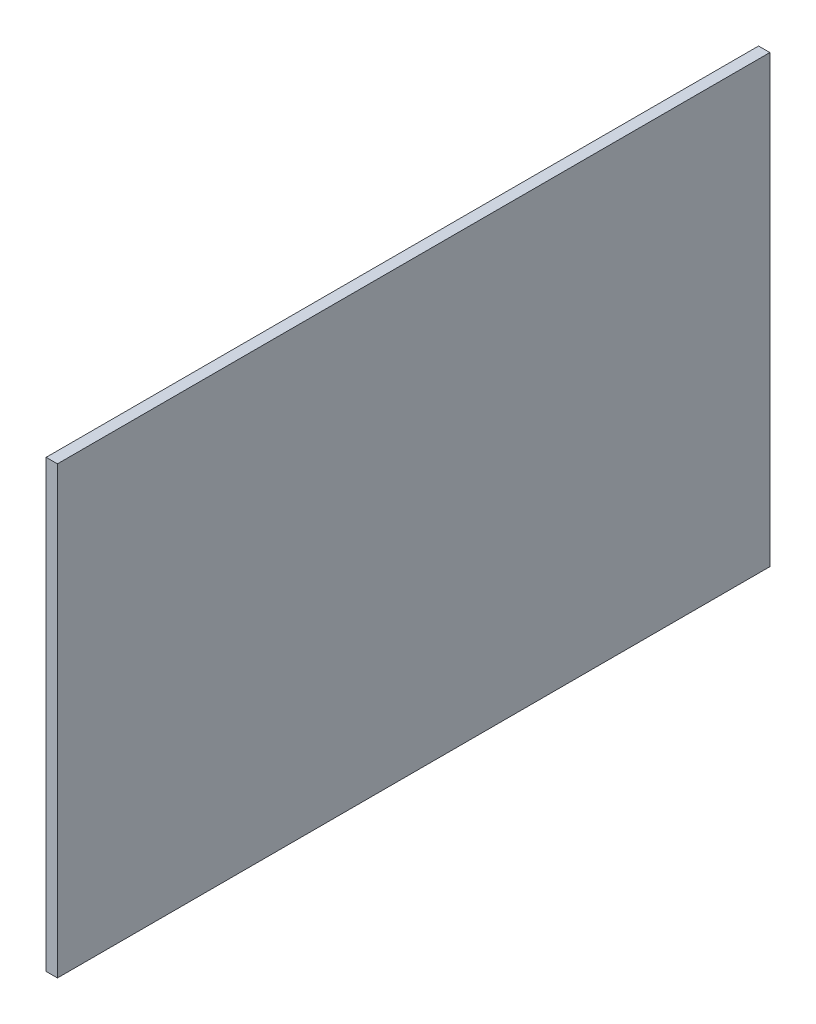
ISO-10303-21;
HEADER;
FILE_DESCRIPTION(('STEP AP214'),'2;1');
FILE_NAME('part.step','',(''),(''),'','','');
FILE_SCHEMA(('AUTOMOTIVE_DESIGN { 1 0 10303 214 1 1 1 1 }'));
ENDSEC;
DATA;
#1=APPLICATION_CONTEXT('core data for automotive mechanical design processes');
#2=APPLICATION_PROTOCOL_DEFINITION('international standard','automotive_design',2000,#1);
#3=PRODUCT_CONTEXT('',#1,'mechanical');
#4=PRODUCT('Part','Part','',(#3));
#5=PRODUCT_RELATED_PRODUCT_CATEGORY('part','',(#4));
#6=PRODUCT_DEFINITION_FORMATION('','',#4);
#7=PRODUCT_DEFINITION_CONTEXT('part definition',#1,'design');
#8=PRODUCT_DEFINITION('design','',#6,#7);
#9=PRODUCT_DEFINITION_SHAPE('','',#8);
#10=(LENGTH_UNIT() NAMED_UNIT(*) SI_UNIT(.MILLI.,.METRE.));
#11=(NAMED_UNIT(*) PLANE_ANGLE_UNIT() SI_UNIT($,.RADIAN.));
#12=(NAMED_UNIT(*) SI_UNIT($,.STERADIAN.) SOLID_ANGLE_UNIT());
#13=UNCERTAINTY_MEASURE_WITH_UNIT(LENGTH_MEASURE(1.E-05),#10,'distance_accuracy_value','');
#14=(GEOMETRIC_REPRESENTATION_CONTEXT(3) GLOBAL_UNCERTAINTY_ASSIGNED_CONTEXT((#13)) GLOBAL_UNIT_ASSIGNED_CONTEXT((#10,
#11,#12)) REPRESENTATION_CONTEXT('',''));
#15=CARTESIAN_POINT('',(0.,0.,0.));
#16=DIRECTION('',(0.,0.,1.));
#17=DIRECTION('',(1.,0.,0.));
#18=AXIS2_PLACEMENT_3D('',#15,#16,#17);
#19=CARTESIAN_POINT('',(1.27,49.9999,-79.9973));
#20=DIRECTION('',(0.,0.,1.));
#21=DIRECTION('',(1.,0.,0.));
#22=AXIS2_PLACEMENT_3D('',#19,#20,#21);
#23=PLANE('',#22);
#24=DIRECTION('',(0.,1.,0.));
#25=VECTOR('',#24,1.);
#26=CARTESIAN_POINT('',(-1.27,49.9999,-79.9973));
#27=LINE('',#26,#25);
#28=CARTESIAN_POINT('',(-1.27,-49.9999,-79.9973));
#29=VERTEX_POINT('',#28);
#30=CARTESIAN_POINT('',(-1.27,49.9999,-79.9973));
#31=VERTEX_POINT('',#30);
#32=EDGE_CURVE('E95',#29,#31,#27,.T.);
#33=ORIENTED_EDGE('',*,*,#32,.T.);
#34=DIRECTION('',(-1.,0.,0.));
#35=VECTOR('',#34,1.);
#36=CARTESIAN_POINT('',(1.27,49.9999,-79.9973));
#37=LINE('',#36,#35);
#38=CARTESIAN_POINT('',(1.27,49.9999,-79.9973));
#39=VERTEX_POINT('',#38);
#40=EDGE_CURVE('E11',#39,#31,#37,.T.);
#41=ORIENTED_EDGE('',*,*,#40,.F.);
#42=DIRECTION('',(0.,1.,0.));
#43=VECTOR('',#42,1.);
#44=CARTESIAN_POINT('',(1.27,49.9999,-79.9973));
#45=LINE('',#44,#43);
#46=CARTESIAN_POINT('',(1.27,-49.9999,-79.9973));
#47=VERTEX_POINT('',#46);
#48=EDGE_CURVE('E83',#47,#39,#45,.T.);
#49=ORIENTED_EDGE('',*,*,#48,.F.);
#50=DIRECTION('',(-1.,0.,0.));
#51=VECTOR('',#50,1.);
#52=CARTESIAN_POINT('',(1.27,-49.9999,-79.9973));
#53=LINE('',#52,#51);
#54=EDGE_CURVE('E91',#47,#29,#53,.T.);
#55=ORIENTED_EDGE('',*,*,#54,.T.);
#56=EDGE_LOOP('',(#33,#41,#49,#55));
#57=FACE_BOUND('',#56,.T.);
#58=ADVANCED_FACE('F32',(#57),#23,.F.);
#59=CARTESIAN_POINT('',(1.27,49.9999,79.9973));
#60=DIRECTION('',(0.,-1.,0.));
#61=DIRECTION('',(0.,0.,-1.));
#62=AXIS2_PLACEMENT_3D('',#59,#60,#61);
#63=PLANE('',#62);
#64=DIRECTION('',(0.,0.,1.));
#65=VECTOR('',#64,1.);
#66=CARTESIAN_POINT('',(-1.27,49.9999,79.9973));
#67=LINE('',#66,#65);
#68=CARTESIAN_POINT('',(-1.27,49.9999,79.9973));
#69=VERTEX_POINT('',#68);
#70=EDGE_CURVE('E87',#31,#69,#67,.T.);
#71=ORIENTED_EDGE('',*,*,#70,.T.);
#72=DIRECTION('',(-1.,0.,0.));
#73=VECTOR('',#72,1.);
#74=CARTESIAN_POINT('',(1.27,49.9999,79.9973));
#75=LINE('',#74,#73);
#76=CARTESIAN_POINT('',(1.27,49.9999,79.9973));
#77=VERTEX_POINT('',#76);
#78=EDGE_CURVE('E40',#77,#69,#75,.T.);
#79=ORIENTED_EDGE('',*,*,#78,.F.);
#80=DIRECTION('',(0.,0.,1.));
#81=VECTOR('',#80,1.);
#82=CARTESIAN_POINT('',(1.27,49.9999,79.9973));
#83=LINE('',#82,#81);
#84=EDGE_CURVE('E78',#39,#77,#83,.T.);
#85=ORIENTED_EDGE('',*,*,#84,.F.);
#86=ORIENTED_EDGE('',*,*,#40,.T.);
#87=EDGE_LOOP('',(#71,#79,#85,#86));
#88=FACE_BOUND('',#87,.T.);
#89=ADVANCED_FACE('F86',(#88),#63,.F.);
#90=CARTESIAN_POINT('',(1.27,49.9999,79.9973));
#91=DIRECTION('',(0.,0.,-1.));
#92=DIRECTION('',(0.,1.,0.));
#93=AXIS2_PLACEMENT_3D('',#90,#91,#92);
#94=PLANE('',#93);
#95=DIRECTION('',(0.,-1.,0.));
#96=VECTOR('',#95,1.);
#97=CARTESIAN_POINT('',(-1.27,49.9999,79.9973));
#98=LINE('',#97,#96);
#99=CARTESIAN_POINT('',(-1.27,-49.9999,79.9973));
#100=VERTEX_POINT('',#99);
#101=EDGE_CURVE('E65',#69,#100,#98,.T.);
#102=ORIENTED_EDGE('',*,*,#101,.T.);
#103=DIRECTION('',(-1.,0.,0.));
#104=VECTOR('',#103,1.);
#105=CARTESIAN_POINT('',(1.27,-49.9999,79.9973));
#106=LINE('',#105,#104);
#107=CARTESIAN_POINT('',(1.27,-49.9999,79.9973));
#108=VERTEX_POINT('',#107);
#109=EDGE_CURVE('E88',#108,#100,#106,.T.);
#110=ORIENTED_EDGE('',*,*,#109,.F.);
#111=DIRECTION('',(0.,-1.,0.));
#112=VECTOR('',#111,1.);
#113=CARTESIAN_POINT('',(1.27,49.9999,79.9973));
#114=LINE('',#113,#112);
#115=EDGE_CURVE('E81',#77,#108,#114,.T.);
#116=ORIENTED_EDGE('',*,*,#115,.F.);
#117=ORIENTED_EDGE('',*,*,#78,.T.);
#118=EDGE_LOOP('',(#102,#110,#116,#117));
#119=FACE_BOUND('',#118,.T.);
#120=ADVANCED_FACE('F89',(#119),#94,.F.);
#121=CARTESIAN_POINT('',(1.27,-49.9999,79.9973));
#122=DIRECTION('',(0.,1.,0.));
#123=DIRECTION('',(0.,0.,1.));
#124=AXIS2_PLACEMENT_3D('',#121,#122,#123);
#125=PLANE('',#124);
#126=DIRECTION('',(0.,0.,-1.));
#127=VECTOR('',#126,1.);
#128=CARTESIAN_POINT('',(-1.27,-49.9999,79.9973));
#129=LINE('',#128,#127);
#130=EDGE_CURVE('E71',#100,#29,#129,.T.);
#131=ORIENTED_EDGE('',*,*,#130,.T.);
#132=ORIENTED_EDGE('',*,*,#54,.F.);
#133=DIRECTION('',(0.,0.,-1.));
#134=VECTOR('',#133,1.);
#135=CARTESIAN_POINT('',(1.27,-49.9999,79.9973));
#136=LINE('',#135,#134);
#137=EDGE_CURVE('E48',#108,#47,#136,.T.);
#138=ORIENTED_EDGE('',*,*,#137,.F.);
#139=ORIENTED_EDGE('',*,*,#109,.T.);
#140=EDGE_LOOP('',(#131,#132,#138,#139));
#141=FACE_BOUND('',#140,.T.);
#142=ADVANCED_FACE('F102',(#141),#125,.F.);
#143=CARTESIAN_POINT('',(1.27,0.,0.));
#144=DIRECTION('',(1.,0.,0.));
#145=DIRECTION('',(0.,0.,-1.));
#146=AXIS2_PLACEMENT_3D('',#143,#144,#145);
#147=PLANE('',#146);
#148=ORIENTED_EDGE('',*,*,#48,.T.);
#149=ORIENTED_EDGE('',*,*,#84,.T.);
#150=ORIENTED_EDGE('',*,*,#115,.T.);
#151=ORIENTED_EDGE('',*,*,#137,.T.);
#152=EDGE_LOOP('',(#148,#149,#150,#151));
#153=FACE_BOUND('',#152,.T.);
#154=ADVANCED_FACE('F79',(#153),#147,.T.);
#155=CARTESIAN_POINT('',(-1.27,0.,0.));
#156=DIRECTION('',(1.,0.,0.));
#157=DIRECTION('',(0.,0.,-1.));
#158=AXIS2_PLACEMENT_3D('',#155,#156,#157);
#159=PLANE('',#158);
#160=ORIENTED_EDGE('',*,*,#32,.F.);
#161=ORIENTED_EDGE('',*,*,#130,.F.);
#162=ORIENTED_EDGE('',*,*,#101,.F.);
#163=ORIENTED_EDGE('',*,*,#70,.F.);
#164=EDGE_LOOP('',(#160,#161,#162,#163));
#165=FACE_BOUND('',#164,.T.);
#166=ADVANCED_FACE('F105',(#165),#159,.F.);
#167=CLOSED_SHELL('',(#58,#89,#120,#142,#154,#166));
#168=MANIFOLD_SOLID_BREP('B2',#167);
#169=ADVANCED_BREP_SHAPE_REPRESENTATION('',(#18,#168),#14);
#170=SHAPE_DEFINITION_REPRESENTATION(#9,#169);
ENDSEC;
END-ISO-10303-21;
